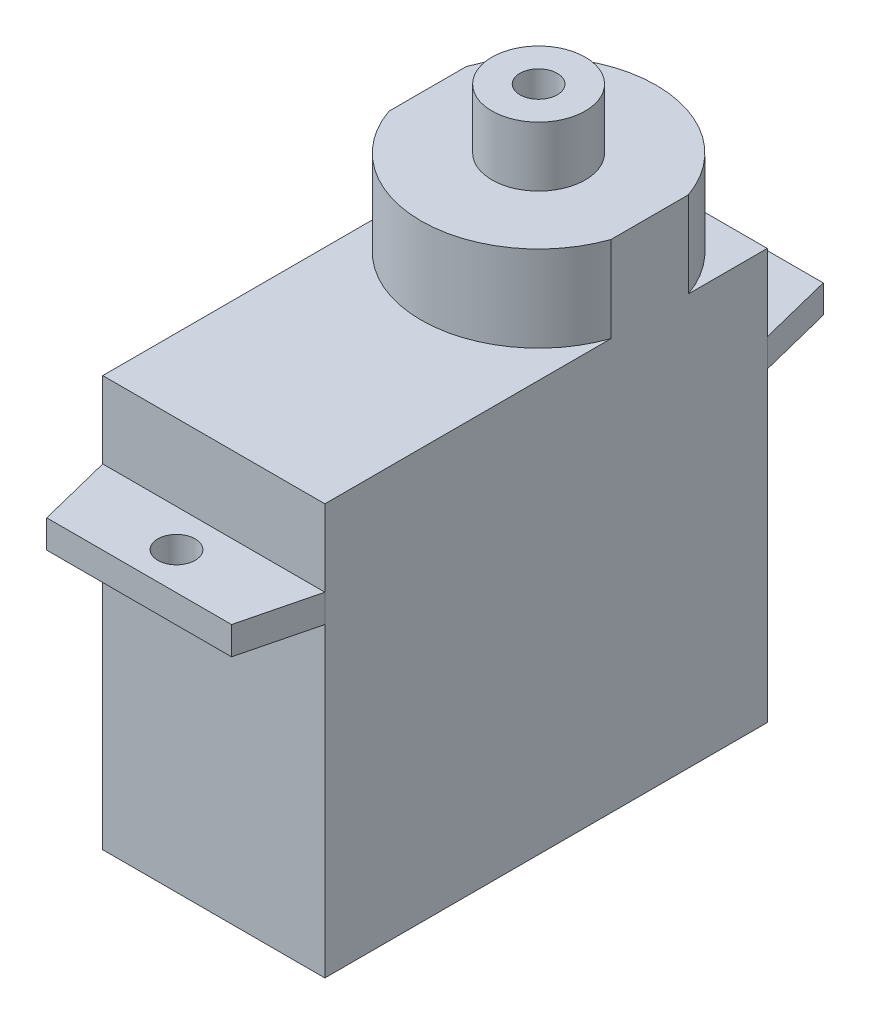
ISO-10303-21;
HEADER;
FILE_DESCRIPTION(('STEP AP214'),'2;1');
FILE_NAME('part.step','',(''),(''),'','','');
FILE_SCHEMA(('AUTOMOTIVE_DESIGN { 1 0 10303 214 1 1 1 1 }'));
ENDSEC;
DATA;
#1=APPLICATION_CONTEXT('core data for automotive mechanical design processes');
#2=APPLICATION_PROTOCOL_DEFINITION('international standard','automotive_design',2000,#1);
#3=PRODUCT_CONTEXT('',#1,'mechanical');
#4=PRODUCT('Part','Part','',(#3));
#5=PRODUCT_RELATED_PRODUCT_CATEGORY('part','',(#4));
#6=PRODUCT_DEFINITION_FORMATION('','',#4);
#7=PRODUCT_DEFINITION_CONTEXT('part definition',#1,'design');
#8=PRODUCT_DEFINITION('design','',#6,#7);
#9=PRODUCT_DEFINITION_SHAPE('','',#8);
#10=(LENGTH_UNIT() NAMED_UNIT(*) SI_UNIT(.MILLI.,.METRE.));
#11=(NAMED_UNIT(*) PLANE_ANGLE_UNIT() SI_UNIT($,.RADIAN.));
#12=(NAMED_UNIT(*) SI_UNIT($,.STERADIAN.) SOLID_ANGLE_UNIT());
#13=UNCERTAINTY_MEASURE_WITH_UNIT(LENGTH_MEASURE(1.E-05),#10,'distance_accuracy_value','');
#14=(GEOMETRIC_REPRESENTATION_CONTEXT(3) GLOBAL_UNCERTAINTY_ASSIGNED_CONTEXT((#13)) GLOBAL_UNIT_ASSIGNED_CONTEXT((#10,
#11,#12)) REPRESENTATION_CONTEXT('',''));
#15=CARTESIAN_POINT('',(0.,0.,0.));
#16=DIRECTION('',(0.,0.,1.));
#17=DIRECTION('',(1.,0.,0.));
#18=AXIS2_PLACEMENT_3D('',#15,#16,#17);
#19=CARTESIAN_POINT('',(0.,22.,0.));
#20=DIRECTION('',(0.,1.,0.));
#21=DIRECTION('',(0.,0.,1.));
#22=AXIS2_PLACEMENT_3D('',#19,#20,#21);
#23=PLANE('',#22);
#24=CARTESIAN_POINT('',(0.,22.,-5.55));
#25=DIRECTION('',(0.,1.,0.));
#26=DIRECTION('',(0.,0.,1.));
#27=AXIS2_PLACEMENT_3D('',#24,#25,#26);
#28=CIRCLE('',#27,6.3);
#29=CARTESIAN_POINT('',(-5.95,22.,-3.47937207591514));
#30=VERTEX_POINT('',#29);
#31=CARTESIAN_POINT('',(5.95,22.,-3.47937207591514));
#32=VERTEX_POINT('',#31);
#33=EDGE_CURVE('E202',#30,#32,#28,.T.);
#34=ORIENTED_EDGE('',*,*,#33,.F.);
#35=DIRECTION('',(0.,0.,1.));
#36=VECTOR('',#35,1.);
#37=CARTESIAN_POINT('',(-5.95,22.,-11.85));
#38=LINE('',#37,#36);
#39=CARTESIAN_POINT('',(-5.95,22.,11.85));
#40=VERTEX_POINT('',#39);
#41=EDGE_CURVE('E221',#30,#40,#38,.T.);
#42=ORIENTED_EDGE('',*,*,#41,.T.);
#43=DIRECTION('',(1.,0.,0.));
#44=VECTOR('',#43,1.);
#45=CARTESIAN_POINT('',(-5.95,22.,11.85));
#46=LINE('',#45,#44);
#47=CARTESIAN_POINT('',(5.95,22.,11.85));
#48=VERTEX_POINT('',#47);
#49=EDGE_CURVE('E220',#40,#48,#46,.T.);
#50=ORIENTED_EDGE('',*,*,#49,.T.);
#51=DIRECTION('',(0.,0.,-1.));
#52=VECTOR('',#51,1.);
#53=CARTESIAN_POINT('',(5.95,22.,-11.85));
#54=LINE('',#53,#52);
#55=EDGE_CURVE('E225',#48,#32,#54,.T.);
#56=ORIENTED_EDGE('',*,*,#55,.T.);
#57=EDGE_LOOP('',(#34,#42,#50,#56));
#58=FACE_BOUND('',#57,.T.);
#59=ADVANCED_FACE('F50',(#58),#23,.T.);
#60=CARTESIAN_POINT('',(0.,22.,-5.55));
#61=DIRECTION('',(0.,1.,0.));
#62=DIRECTION('',(0.,0.,1.));
#63=AXIS2_PLACEMENT_3D('',#60,#61,#62);
#64=CIRCLE('',#63,6.3);
#65=CARTESIAN_POINT('',(5.95,22.,-7.62062792408487));
#66=VERTEX_POINT('',#65);
#67=CARTESIAN_POINT('',(0.,22.,-11.85));
#68=VERTEX_POINT('',#67);
#69=EDGE_CURVE('E73',#66,#68,#64,.T.);
#70=ORIENTED_EDGE('',*,*,#69,.F.);
#71=CARTESIAN_POINT('',(5.95,22.,-11.85));
#72=VERTEX_POINT('',#71);
#73=EDGE_CURVE('E224',#66,#72,#54,.T.);
#74=ORIENTED_EDGE('',*,*,#73,.T.);
#75=DIRECTION('',(-1.,0.,0.));
#76=VECTOR('',#75,1.);
#77=CARTESIAN_POINT('',(-5.95,22.,-11.85));
#78=LINE('',#77,#76);
#79=EDGE_CURVE('E229',#72,#68,#78,.T.);
#80=ORIENTED_EDGE('',*,*,#79,.T.);
#81=EDGE_LOOP('',(#70,#74,#80));
#82=FACE_BOUND('',#81,.T.);
#83=ADVANCED_FACE('F443',(#82),#23,.T.);
#84=CARTESIAN_POINT('',(0.,17.9,0.));
#85=DIRECTION('',(0.,-1.,0.));
#86=DIRECTION('',(0.,0.,-1.));
#87=AXIS2_PLACEMENT_3D('',#84,#85,#86);
#88=PLANE('',#87);
#89=CARTESIAN_POINT('',(0.,17.9,-13.85));
#90=DIRECTION('',(0.,1.,0.));
#91=DIRECTION('',(0.,0.,1.));
#92=AXIS2_PLACEMENT_3D('',#89,#90,#91);
#93=CIRCLE('',#92,1.);
#94=CARTESIAN_POINT('',(0.,17.9,-12.85));
#95=VERTEX_POINT('',#94);
#96=EDGE_CURVE('E260',#95,#95,#93,.T.);
#97=ORIENTED_EDGE('',*,*,#96,.F.);
#98=EDGE_LOOP('',(#97));
#99=FACE_BOUND('',#98,.T.);
#100=DIRECTION('',(-1.,0.,0.));
#101=VECTOR('',#100,1.);
#102=CARTESIAN_POINT('',(-5.95,17.9,-11.85));
#103=LINE('',#102,#101);
#104=CARTESIAN_POINT('',(5.95,17.9,-11.85));
#105=VERTEX_POINT('',#104);
#106=CARTESIAN_POINT('',(-5.95,17.9,-11.85));
#107=VERTEX_POINT('',#106);
#108=EDGE_CURVE('E198',#105,#107,#103,.T.);
#109=ORIENTED_EDGE('',*,*,#108,.F.);
#110=DIRECTION('',(-0.242535625036333,0.,-0.970142500145332));
#111=VECTOR('',#110,1.);
#112=CARTESIAN_POINT('',(4.95,17.9,-15.85));
#113=LINE('',#112,#111);
#114=CARTESIAN_POINT('',(4.95,17.9,-15.85));
#115=VERTEX_POINT('',#114);
#116=EDGE_CURVE('E279',#105,#115,#113,.T.);
#117=ORIENTED_EDGE('',*,*,#116,.T.);
#118=DIRECTION('',(-1.,0.,0.));
#119=VECTOR('',#118,1.);
#120=CARTESIAN_POINT('',(-4.95,17.9,-15.85));
#121=LINE('',#120,#119);
#122=CARTESIAN_POINT('',(-4.95,17.9,-15.85));
#123=VERTEX_POINT('',#122);
#124=EDGE_CURVE('E282',#115,#123,#121,.T.);
#125=ORIENTED_EDGE('',*,*,#124,.T.);
#126=DIRECTION('',(-0.242535625036333,0.,0.970142500145332));
#127=VECTOR('',#126,1.);
#128=CARTESIAN_POINT('',(-5.95,17.9,-11.85));
#129=LINE('',#128,#127);
#130=EDGE_CURVE('E285',#123,#107,#129,.T.);
#131=ORIENTED_EDGE('',*,*,#130,.T.);
#132=EDGE_LOOP('',(#109,#117,#125,#131));
#133=FACE_BOUND('',#132,.T.);
#134=ADVANCED_FACE('F450',(#99,#133),#88,.F.);
#135=CARTESIAN_POINT('',(0.,17.9,13.85));
#136=DIRECTION('',(0.,1.,0.));
#137=DIRECTION('',(0.,0.,1.));
#138=AXIS2_PLACEMENT_3D('',#135,#136,#137);
#139=CIRCLE('',#138,1.);
#140=CARTESIAN_POINT('',(0.,17.9,14.85));
#141=VERTEX_POINT('',#140);
#142=EDGE_CURVE('E252',#141,#141,#139,.T.);
#143=ORIENTED_EDGE('',*,*,#142,.F.);
#144=EDGE_LOOP('',(#143));
#145=FACE_BOUND('',#144,.T.);
#146=DIRECTION('',(1.,0.,0.));
#147=VECTOR('',#146,1.);
#148=CARTESIAN_POINT('',(-5.95,17.9,11.85));
#149=LINE('',#148,#147);
#150=CARTESIAN_POINT('',(-5.95,17.9,11.85));
#151=VERTEX_POINT('',#150);
#152=CARTESIAN_POINT('',(5.95,17.9,11.85));
#153=VERTEX_POINT('',#152);
#154=EDGE_CURVE('E193',#151,#153,#149,.T.);
#155=ORIENTED_EDGE('',*,*,#154,.F.);
#156=DIRECTION('',(0.242535625036333,0.,0.970142500145332));
#157=VECTOR('',#156,1.);
#158=CARTESIAN_POINT('',(-4.95,17.9,15.85));
#159=LINE('',#158,#157);
#160=CARTESIAN_POINT('',(-4.95,17.9,15.85));
#161=VERTEX_POINT('',#160);
#162=EDGE_CURVE('E268',#151,#161,#159,.T.);
#163=ORIENTED_EDGE('',*,*,#162,.T.);
#164=DIRECTION('',(1.,0.,0.));
#165=VECTOR('',#164,1.);
#166=CARTESIAN_POINT('',(4.95,17.9,15.85));
#167=LINE('',#166,#165);
#168=CARTESIAN_POINT('',(4.95,17.9,15.85));
#169=VERTEX_POINT('',#168);
#170=EDGE_CURVE('E271',#161,#169,#167,.T.);
#171=ORIENTED_EDGE('',*,*,#170,.T.);
#172=DIRECTION('',(0.242535625036333,0.,-0.970142500145332));
#173=VECTOR('',#172,1.);
#174=CARTESIAN_POINT('',(5.95,17.9,11.85));
#175=LINE('',#174,#173);
#176=EDGE_CURVE('E275',#169,#153,#175,.T.);
#177=ORIENTED_EDGE('',*,*,#176,.T.);
#178=EDGE_LOOP('',(#155,#163,#171,#177));
#179=FACE_BOUND('',#178,.T.);
#180=ADVANCED_FACE('F402',(#145,#179),#88,.F.);
#181=CARTESIAN_POINT('',(-5.95,16.4,-11.85));
#182=DIRECTION('',(1.,0.,0.));
#183=DIRECTION('',(0.,0.,-1.));
#184=AXIS2_PLACEMENT_3D('',#181,#182,#183);
#185=PLANE('',#184);
#186=DIRECTION('',(0.,0.,1.));
#187=VECTOR('',#186,1.);
#188=CARTESIAN_POINT('',(-5.95,0.,-11.85));
#189=LINE('',#188,#187);
#190=CARTESIAN_POINT('',(-5.95,0.,-11.85));
#191=VERTEX_POINT('',#190);
#192=CARTESIAN_POINT('',(-5.95,0.,11.85));
#193=VERTEX_POINT('',#192);
#194=EDGE_CURVE('E338',#191,#193,#189,.T.);
#195=ORIENTED_EDGE('',*,*,#194,.T.);
#196=DIRECTION('',(0.,-1.,0.));
#197=VECTOR('',#196,1.);
#198=CARTESIAN_POINT('',(-5.95,16.4,11.85));
#199=LINE('',#198,#197);
#200=CARTESIAN_POINT('',(-5.95,16.4,11.85));
#201=VERTEX_POINT('',#200);
#202=EDGE_CURVE('E369',#201,#193,#199,.T.);
#203=ORIENTED_EDGE('',*,*,#202,.F.);
#204=DIRECTION('',(0.,-1.,0.));
#205=VECTOR('',#204,1.);
#206=CARTESIAN_POINT('',(-5.95,17.9,11.85));
#207=LINE('',#206,#205);
#208=EDGE_CURVE('E334',#151,#201,#207,.T.);
#209=ORIENTED_EDGE('',*,*,#208,.F.);
#210=DIRECTION('',(0.,-1.,0.));
#211=VECTOR('',#210,1.);
#212=CARTESIAN_POINT('',(-5.95,22.,11.85));
#213=LINE('',#212,#211);
#214=EDGE_CURVE('E247',#40,#151,#213,.T.);
#215=ORIENTED_EDGE('',*,*,#214,.F.);
#216=ORIENTED_EDGE('',*,*,#41,.F.);
#217=DIRECTION('',(0.,-1.,0.));
#218=VECTOR('',#217,1.);
#219=CARTESIAN_POINT('',(-5.95,70.5311857643959,-3.47937207591514));
#220=LINE('',#219,#218);
#221=CARTESIAN_POINT('',(-5.95,26.6,-3.47937207591514));
#222=VERTEX_POINT('',#221);
#223=EDGE_CURVE('E182',#222,#30,#220,.T.);
#224=ORIENTED_EDGE('',*,*,#223,.F.);
#225=DIRECTION('',(0.,0.,1.));
#226=VECTOR('',#225,1.);
#227=CARTESIAN_POINT('',(-5.95,26.6,-7.62062792408486));
#228=LINE('',#227,#226);
#229=CARTESIAN_POINT('',(-5.95,26.6,-7.62062792408486));
#230=VERTEX_POINT('',#229);
#231=EDGE_CURVE('E176',#230,#222,#228,.T.);
#232=ORIENTED_EDGE('',*,*,#231,.F.);
#233=DIRECTION('',(0.,-1.,0.));
#234=VECTOR('',#233,1.);
#235=CARTESIAN_POINT('',(-5.95,70.5311857643959,-7.62062792408486));
#236=LINE('',#235,#234);
#237=CARTESIAN_POINT('',(-5.95,22.,-7.62062792408486));
#238=VERTEX_POINT('',#237);
#239=EDGE_CURVE('E166',#230,#238,#236,.T.);
#240=ORIENTED_EDGE('',*,*,#239,.T.);
#241=CARTESIAN_POINT('',(-5.95,22.,-11.85));
#242=VERTEX_POINT('',#241);
#243=EDGE_CURVE('E217',#242,#238,#38,.T.);
#244=ORIENTED_EDGE('',*,*,#243,.F.);
#245=DIRECTION('',(0.,-1.,0.));
#246=VECTOR('',#245,1.);
#247=CARTESIAN_POINT('',(-5.95,22.,-11.85));
#248=LINE('',#247,#246);
#249=EDGE_CURVE('E231',#242,#107,#248,.T.);
#250=ORIENTED_EDGE('',*,*,#249,.T.);
#251=DIRECTION('',(0.,-1.,0.));
#252=VECTOR('',#251,1.);
#253=CARTESIAN_POINT('',(-5.95,17.9,-11.85));
#254=LINE('',#253,#252);
#255=CARTESIAN_POINT('',(-5.95,16.4,-11.85));
#256=VERTEX_POINT('',#255);
#257=EDGE_CURVE('E288',#107,#256,#254,.T.);
#258=ORIENTED_EDGE('',*,*,#257,.T.);
#259=DIRECTION('',(0.,-1.,0.));
#260=VECTOR('',#259,1.);
#261=CARTESIAN_POINT('',(-5.95,16.4,-11.85));
#262=LINE('',#261,#260);
#263=EDGE_CURVE('E348',#256,#191,#262,.T.);
#264=ORIENTED_EDGE('',*,*,#263,.T.);
#265=EDGE_LOOP('',(#195,#203,#209,#215,#216,#224,#232,#240,#244,#250,#258,#264));
#266=FACE_BOUND('',#265,.T.);
#267=ADVANCED_FACE('F52',(#266),#185,.F.);
#268=CARTESIAN_POINT('',(-5.95,16.4,11.85));
#269=DIRECTION('',(0.,0.,-1.));
#270=DIRECTION('',(-1.,0.,0.));
#271=AXIS2_PLACEMENT_3D('',#268,#269,#270);
#272=PLANE('',#271);
#273=DIRECTION('',(1.,0.,0.));
#274=VECTOR('',#273,1.);
#275=CARTESIAN_POINT('',(-5.95,0.,11.85));
#276=LINE('',#275,#274);
#277=CARTESIAN_POINT('',(5.95,0.,11.85));
#278=VERTEX_POINT('',#277);
#279=EDGE_CURVE('E351',#193,#278,#276,.T.);
#280=ORIENTED_EDGE('',*,*,#279,.T.);
#281=DIRECTION('',(0.,-1.,0.));
#282=VECTOR('',#281,1.);
#283=CARTESIAN_POINT('',(5.95,16.4,11.85));
#284=LINE('',#283,#282);
#285=CARTESIAN_POINT('',(5.95,16.4,11.85));
#286=VERTEX_POINT('',#285);
#287=EDGE_CURVE('E366',#286,#278,#284,.T.);
#288=ORIENTED_EDGE('',*,*,#287,.F.);
#289=DIRECTION('',(1.,0.,0.));
#290=VECTOR('',#289,1.);
#291=CARTESIAN_POINT('',(-5.95,16.4,11.85));
#292=LINE('',#291,#290);
#293=EDGE_CURVE('E339',#201,#286,#292,.T.);
#294=ORIENTED_EDGE('',*,*,#293,.F.);
#295=ORIENTED_EDGE('',*,*,#202,.T.);
#296=EDGE_LOOP('',(#280,#288,#294,#295));
#297=FACE_BOUND('',#296,.T.);
#298=ADVANCED_FACE('F511',(#297),#272,.F.);
#299=CARTESIAN_POINT('',(5.95,16.4,-11.85));
#300=DIRECTION('',(-1.,0.,0.));
#301=DIRECTION('',(0.,0.,1.));
#302=AXIS2_PLACEMENT_3D('',#299,#300,#301);
#303=PLANE('',#302);
#304=DIRECTION('',(0.,0.,-1.));
#305=VECTOR('',#304,1.);
#306=CARTESIAN_POINT('',(5.95,0.,-11.85));
#307=LINE('',#306,#305);
#308=CARTESIAN_POINT('',(5.95,0.,-11.85));
#309=VERTEX_POINT('',#308);
#310=EDGE_CURVE('E354',#278,#309,#307,.T.);
#311=ORIENTED_EDGE('',*,*,#310,.T.);
#312=DIRECTION('',(0.,-1.,0.));
#313=VECTOR('',#312,1.);
#314=CARTESIAN_POINT('',(5.95,16.4,-11.85));
#315=LINE('',#314,#313);
#316=CARTESIAN_POINT('',(5.95,16.4,-11.85));
#317=VERTEX_POINT('',#316);
#318=EDGE_CURVE('E362',#317,#309,#315,.T.);
#319=ORIENTED_EDGE('',*,*,#318,.F.);
#320=DIRECTION('',(0.,-1.,0.));
#321=VECTOR('',#320,1.);
#322=CARTESIAN_POINT('',(5.95,17.9,-11.85));
#323=LINE('',#322,#321);
#324=EDGE_CURVE('E318',#105,#317,#323,.T.);
#325=ORIENTED_EDGE('',*,*,#324,.F.);
#326=DIRECTION('',(0.,-1.,0.));
#327=VECTOR('',#326,1.);
#328=CARTESIAN_POINT('',(5.95,22.,-11.85));
#329=LINE('',#328,#327);
#330=EDGE_CURVE('E239',#72,#105,#329,.T.);
#331=ORIENTED_EDGE('',*,*,#330,.F.);
#332=ORIENTED_EDGE('',*,*,#73,.F.);
#333=DIRECTION('',(0.,-1.,0.));
#334=VECTOR('',#333,1.);
#335=CARTESIAN_POINT('',(5.95,70.5311857643959,-7.62062792408487));
#336=LINE('',#335,#334);
#337=CARTESIAN_POINT('',(5.95,26.6,-7.62062792408487));
#338=VERTEX_POINT('',#337);
#339=EDGE_CURVE('E211',#338,#66,#336,.T.);
#340=ORIENTED_EDGE('',*,*,#339,.F.);
#341=DIRECTION('',(0.,0.,-1.));
#342=VECTOR('',#341,1.);
#343=CARTESIAN_POINT('',(5.95,26.6,-7.62062792408487));
#344=LINE('',#343,#342);
#345=CARTESIAN_POINT('',(5.95,26.6,-3.47937207591513));
#346=VERTEX_POINT('',#345);
#347=EDGE_CURVE('E191',#346,#338,#344,.T.);
#348=ORIENTED_EDGE('',*,*,#347,.F.);
#349=DIRECTION('',(0.,-1.,0.));
#350=VECTOR('',#349,1.);
#351=CARTESIAN_POINT('',(5.95,70.5311857643959,-3.47937207591513));
#352=LINE('',#351,#350);
#353=EDGE_CURVE('E207',#346,#32,#352,.T.);
#354=ORIENTED_EDGE('',*,*,#353,.T.);
#355=ORIENTED_EDGE('',*,*,#55,.F.);
#356=DIRECTION('',(0.,-1.,0.));
#357=VECTOR('',#356,1.);
#358=CARTESIAN_POINT('',(5.95,22.,11.85));
#359=LINE('',#358,#357);
#360=EDGE_CURVE('E243',#48,#153,#359,.T.);
#361=ORIENTED_EDGE('',*,*,#360,.T.);
#362=DIRECTION('',(0.,-1.,0.));
#363=VECTOR('',#362,1.);
#364=CARTESIAN_POINT('',(5.95,17.9,11.85));
#365=LINE('',#364,#363);
#366=EDGE_CURVE('E322',#153,#286,#365,.T.);
#367=ORIENTED_EDGE('',*,*,#366,.T.);
#368=ORIENTED_EDGE('',*,*,#287,.T.);
#369=EDGE_LOOP('',(#311,#319,#325,#331,#332,#340,#348,#354,#355,#361,#367,#368));
#370=FACE_BOUND('',#369,.T.);
#371=ADVANCED_FACE('F378',(#370),#303,.F.);
#372=CARTESIAN_POINT('',(-5.95,16.4,-11.85));
#373=DIRECTION('',(0.,0.,1.));
#374=DIRECTION('',(1.,0.,0.));
#375=AXIS2_PLACEMENT_3D('',#372,#373,#374);
#376=PLANE('',#375);
#377=DIRECTION('',(-1.,0.,0.));
#378=VECTOR('',#377,1.);
#379=CARTESIAN_POINT('',(-5.95,0.,-11.85));
#380=LINE('',#379,#378);
#381=EDGE_CURVE('E344',#309,#191,#380,.T.);
#382=ORIENTED_EDGE('',*,*,#381,.T.);
#383=ORIENTED_EDGE('',*,*,#263,.F.);
#384=DIRECTION('',(-1.,0.,0.));
#385=VECTOR('',#384,1.);
#386=CARTESIAN_POINT('',(-5.95,16.4,-11.85));
#387=LINE('',#386,#385);
#388=EDGE_CURVE('E343',#317,#256,#387,.T.);
#389=ORIENTED_EDGE('',*,*,#388,.F.);
#390=ORIENTED_EDGE('',*,*,#318,.T.);
#391=EDGE_LOOP('',(#382,#383,#389,#390));
#392=FACE_BOUND('',#391,.T.);
#393=ADVANCED_FACE('F506',(#392),#376,.F.);
#394=CARTESIAN_POINT('',(0.,0.,0.));
#395=DIRECTION('',(0.,1.,0.));
#396=DIRECTION('',(0.,0.,1.));
#397=AXIS2_PLACEMENT_3D('',#394,#395,#396);
#398=PLANE('',#397);
#399=ORIENTED_EDGE('',*,*,#194,.F.);
#400=ORIENTED_EDGE('',*,*,#381,.F.);
#401=ORIENTED_EDGE('',*,*,#310,.F.);
#402=ORIENTED_EDGE('',*,*,#279,.F.);
#403=EDGE_LOOP('',(#399,#400,#401,#402));
#404=FACE_BOUND('',#403,.T.);
#405=ADVANCED_FACE('F503',(#404),#398,.F.);
#406=CARTESIAN_POINT('',(0.,16.4,0.));
#407=DIRECTION('',(0.,-1.,0.));
#408=DIRECTION('',(0.,0.,-1.));
#409=AXIS2_PLACEMENT_3D('',#406,#407,#408);
#410=PLANE('',#409);
#411=CARTESIAN_POINT('',(0.,16.4,13.85));
#412=DIRECTION('',(0.,1.,0.));
#413=DIRECTION('',(0.,0.,1.));
#414=AXIS2_PLACEMENT_3D('',#411,#412,#413);
#415=CIRCLE('',#414,1.);
#416=CARTESIAN_POINT('',(0.,16.4,14.85));
#417=VERTEX_POINT('',#416);
#418=EDGE_CURVE('E251',#417,#417,#415,.T.);
#419=ORIENTED_EDGE('',*,*,#418,.T.);
#420=EDGE_LOOP('',(#419));
#421=FACE_BOUND('',#420,.T.);
#422=DIRECTION('',(0.242535625036333,0.,0.970142500145332));
#423=VECTOR('',#422,1.);
#424=CARTESIAN_POINT('',(-4.95,16.4,15.85));
#425=LINE('',#424,#423);
#426=CARTESIAN_POINT('',(-4.95,16.4,15.85));
#427=VERTEX_POINT('',#426);
#428=EDGE_CURVE('E264',#201,#427,#425,.T.);
#429=ORIENTED_EDGE('',*,*,#428,.F.);
#430=ORIENTED_EDGE('',*,*,#293,.T.);
#431=DIRECTION('',(0.242535625036333,0.,-0.970142500145332));
#432=VECTOR('',#431,1.);
#433=CARTESIAN_POINT('',(5.95,16.4,11.85));
#434=LINE('',#433,#432);
#435=CARTESIAN_POINT('',(4.95,16.4,15.85));
#436=VERTEX_POINT('',#435);
#437=EDGE_CURVE('E294',#436,#286,#434,.T.);
#438=ORIENTED_EDGE('',*,*,#437,.F.);
#439=DIRECTION('',(1.,0.,0.));
#440=VECTOR('',#439,1.);
#441=CARTESIAN_POINT('',(4.95,16.4,15.85));
#442=LINE('',#441,#440);
#443=EDGE_CURVE('E291',#427,#436,#442,.T.);
#444=ORIENTED_EDGE('',*,*,#443,.F.);
#445=EDGE_LOOP('',(#429,#430,#438,#444));
#446=FACE_BOUND('',#445,.T.);
#447=ADVANCED_FACE('F480',(#421,#446),#410,.T.);
#448=CARTESIAN_POINT('',(0.,16.4,-13.85));
#449=DIRECTION('',(0.,1.,0.));
#450=DIRECTION('',(0.,0.,1.));
#451=AXIS2_PLACEMENT_3D('',#448,#449,#450);
#452=CIRCLE('',#451,1.);
#453=CARTESIAN_POINT('',(0.,16.4,-12.85));
#454=VERTEX_POINT('',#453);
#455=EDGE_CURVE('E256',#454,#454,#452,.T.);
#456=ORIENTED_EDGE('',*,*,#455,.T.);
#457=EDGE_LOOP('',(#456));
#458=FACE_BOUND('',#457,.T.);
#459=DIRECTION('',(-0.242535625036333,0.,-0.970142500145332));
#460=VECTOR('',#459,1.);
#461=CARTESIAN_POINT('',(4.95,16.4,-15.85));
#462=LINE('',#461,#460);
#463=CARTESIAN_POINT('',(4.95,16.4,-15.85));
#464=VERTEX_POINT('',#463);
#465=EDGE_CURVE('E298',#317,#464,#462,.T.);
#466=ORIENTED_EDGE('',*,*,#465,.F.);
#467=ORIENTED_EDGE('',*,*,#388,.T.);
#468=DIRECTION('',(-0.242535625036333,0.,0.970142500145332));
#469=VECTOR('',#468,1.);
#470=CARTESIAN_POINT('',(-5.95,16.4,-11.85));
#471=LINE('',#470,#469);
#472=CARTESIAN_POINT('',(-4.95,16.4,-15.85));
#473=VERTEX_POINT('',#472);
#474=EDGE_CURVE('E272',#473,#256,#471,.T.);
#475=ORIENTED_EDGE('',*,*,#474,.F.);
#476=DIRECTION('',(-1.,0.,0.));
#477=VECTOR('',#476,1.);
#478=CARTESIAN_POINT('',(-4.95,16.4,-15.85));
#479=LINE('',#478,#477);
#480=EDGE_CURVE('E301',#464,#473,#479,.T.);
#481=ORIENTED_EDGE('',*,*,#480,.F.);
#482=EDGE_LOOP('',(#466,#467,#475,#481));
#483=FACE_BOUND('',#482,.T.);
#484=ADVANCED_FACE('F477',(#458,#483),#410,.T.);
#485=CARTESIAN_POINT('',(-4.95,17.9,15.85));
#486=DIRECTION('',(0.970142500145332,0.,-0.242535625036333));
#487=DIRECTION('',(-0.242535625036333,0.,-0.970142500145332));
#488=AXIS2_PLACEMENT_3D('',#485,#486,#487);
#489=PLANE('',#488);
#490=ORIENTED_EDGE('',*,*,#428,.T.);
#491=DIRECTION('',(0.,-1.,0.));
#492=VECTOR('',#491,1.);
#493=CARTESIAN_POINT('',(-4.95,17.9,15.85));
#494=LINE('',#493,#492);
#495=EDGE_CURVE('E330',#161,#427,#494,.T.);
#496=ORIENTED_EDGE('',*,*,#495,.F.);
#497=ORIENTED_EDGE('',*,*,#162,.F.);
#498=ORIENTED_EDGE('',*,*,#208,.T.);
#499=EDGE_LOOP('',(#490,#496,#497,#498));
#500=FACE_BOUND('',#499,.T.);
#501=ADVANCED_FACE('F398',(#500),#489,.F.);
#502=CARTESIAN_POINT('',(4.95,17.9,15.85));
#503=DIRECTION('',(0.,0.,-1.));
#504=DIRECTION('',(-1.,0.,0.));
#505=AXIS2_PLACEMENT_3D('',#502,#503,#504);
#506=PLANE('',#505);
#507=ORIENTED_EDGE('',*,*,#443,.T.);
#508=DIRECTION('',(0.,-1.,0.));
#509=VECTOR('',#508,1.);
#510=CARTESIAN_POINT('',(4.95,17.9,15.85));
#511=LINE('',#510,#509);
#512=EDGE_CURVE('E326',#169,#436,#511,.T.);
#513=ORIENTED_EDGE('',*,*,#512,.F.);
#514=ORIENTED_EDGE('',*,*,#170,.F.);
#515=ORIENTED_EDGE('',*,*,#495,.T.);
#516=EDGE_LOOP('',(#507,#513,#514,#515));
#517=FACE_BOUND('',#516,.T.);
#518=ADVANCED_FACE('F496',(#517),#506,.F.);
#519=CARTESIAN_POINT('',(5.95,17.9,11.85));
#520=DIRECTION('',(-0.970142500145332,0.,-0.242535625036333));
#521=DIRECTION('',(-0.242535625036333,0.,0.970142500145332));
#522=AXIS2_PLACEMENT_3D('',#519,#520,#521);
#523=PLANE('',#522);
#524=ORIENTED_EDGE('',*,*,#437,.T.);
#525=ORIENTED_EDGE('',*,*,#366,.F.);
#526=ORIENTED_EDGE('',*,*,#176,.F.);
#527=ORIENTED_EDGE('',*,*,#512,.T.);
#528=EDGE_LOOP('',(#524,#525,#526,#527));
#529=FACE_BOUND('',#528,.T.);
#530=ADVANCED_FACE('F492',(#529),#523,.F.);
#531=CARTESIAN_POINT('',(4.95,17.9,-15.85));
#532=DIRECTION('',(-0.970142500145332,0.,0.242535625036333));
#533=DIRECTION('',(0.242535625036333,0.,0.970142500145332));
#534=AXIS2_PLACEMENT_3D('',#531,#532,#533);
#535=PLANE('',#534);
#536=ORIENTED_EDGE('',*,*,#465,.T.);
#537=DIRECTION('',(0.,-1.,0.));
#538=VECTOR('',#537,1.);
#539=CARTESIAN_POINT('',(4.95,17.9,-15.85));
#540=LINE('',#539,#538);
#541=EDGE_CURVE('E314',#115,#464,#540,.T.);
#542=ORIENTED_EDGE('',*,*,#541,.F.);
#543=ORIENTED_EDGE('',*,*,#116,.F.);
#544=ORIENTED_EDGE('',*,*,#324,.T.);
#545=EDGE_LOOP('',(#536,#542,#543,#544));
#546=FACE_BOUND('',#545,.T.);
#547=ADVANCED_FACE('F488',(#546),#535,.F.);
#548=CARTESIAN_POINT('',(-4.95,17.9,-15.85));
#549=DIRECTION('',(0.,0.,1.));
#550=DIRECTION('',(1.,0.,0.));
#551=AXIS2_PLACEMENT_3D('',#548,#549,#550);
#552=PLANE('',#551);
#553=ORIENTED_EDGE('',*,*,#480,.T.);
#554=DIRECTION('',(0.,-1.,0.));
#555=VECTOR('',#554,1.);
#556=CARTESIAN_POINT('',(-4.95,17.9,-15.85));
#557=LINE('',#556,#555);
#558=EDGE_CURVE('E310',#123,#473,#557,.T.);
#559=ORIENTED_EDGE('',*,*,#558,.F.);
#560=ORIENTED_EDGE('',*,*,#124,.F.);
#561=ORIENTED_EDGE('',*,*,#541,.T.);
#562=EDGE_LOOP('',(#553,#559,#560,#561));
#563=FACE_BOUND('',#562,.T.);
#564=ADVANCED_FACE('F484',(#563),#552,.F.);
#565=CARTESIAN_POINT('',(-5.95,17.9,-11.85));
#566=DIRECTION('',(0.970142500145332,0.,0.242535625036333));
#567=DIRECTION('',(0.242535625036333,0.,-0.970142500145332));
#568=AXIS2_PLACEMENT_3D('',#565,#566,#567);
#569=PLANE('',#568);
#570=ORIENTED_EDGE('',*,*,#474,.T.);
#571=ORIENTED_EDGE('',*,*,#257,.F.);
#572=ORIENTED_EDGE('',*,*,#130,.F.);
#573=ORIENTED_EDGE('',*,*,#558,.T.);
#574=EDGE_LOOP('',(#570,#571,#572,#573));
#575=FACE_BOUND('',#574,.T.);
#576=ADVANCED_FACE('F472',(#575),#569,.F.);
#577=CARTESIAN_POINT('',(0.,17.9,-13.85));
#578=DIRECTION('',(0.,-1.,0.));
#579=DIRECTION('',(0.,0.,-1.));
#580=AXIS2_PLACEMENT_3D('',#577,#578,#579);
#581=CYLINDRICAL_SURFACE('',#580,1.);
#582=ORIENTED_EDGE('',*,*,#96,.T.);
#583=EDGE_LOOP('',(#582));
#584=FACE_BOUND('',#583,.T.);
#585=ORIENTED_EDGE('',*,*,#455,.F.);
#586=EDGE_LOOP('',(#585));
#587=FACE_BOUND('',#586,.T.);
#588=ADVANCED_FACE('F468',(#584,#587),#581,.F.);
#589=CARTESIAN_POINT('',(0.,17.9,13.85));
#590=DIRECTION('',(0.,-1.,0.));
#591=DIRECTION('',(0.,0.,-1.));
#592=AXIS2_PLACEMENT_3D('',#589,#590,#591);
#593=CYLINDRICAL_SURFACE('',#592,1.);
#594=ORIENTED_EDGE('',*,*,#142,.T.);
#595=EDGE_LOOP('',(#594));
#596=FACE_BOUND('',#595,.T.);
#597=ORIENTED_EDGE('',*,*,#418,.F.);
#598=EDGE_LOOP('',(#597));
#599=FACE_BOUND('',#598,.T.);
#600=ADVANCED_FACE('F463',(#596,#599),#593,.F.);
#601=CARTESIAN_POINT('',(-5.95,22.,11.85));
#602=DIRECTION('',(0.,0.,-1.));
#603=DIRECTION('',(-1.,0.,0.));
#604=AXIS2_PLACEMENT_3D('',#601,#602,#603);
#605=PLANE('',#604);
#606=ORIENTED_EDGE('',*,*,#154,.T.);
#607=ORIENTED_EDGE('',*,*,#360,.F.);
#608=ORIENTED_EDGE('',*,*,#49,.F.);
#609=ORIENTED_EDGE('',*,*,#214,.T.);
#610=EDGE_LOOP('',(#606,#607,#608,#609));
#611=FACE_BOUND('',#610,.T.);
#612=ADVANCED_FACE('F392',(#611),#605,.F.);
#613=CARTESIAN_POINT('',(-5.95,22.,-11.85));
#614=DIRECTION('',(0.,0.,1.));
#615=DIRECTION('',(1.,0.,0.));
#616=AXIS2_PLACEMENT_3D('',#613,#614,#615);
#617=PLANE('',#616);
#618=ORIENTED_EDGE('',*,*,#108,.T.);
#619=ORIENTED_EDGE('',*,*,#249,.F.);
#620=EDGE_CURVE('E228',#68,#242,#78,.T.);
#621=ORIENTED_EDGE('',*,*,#620,.F.);
#622=ORIENTED_EDGE('',*,*,#79,.F.);
#623=ORIENTED_EDGE('',*,*,#330,.T.);
#624=EDGE_LOOP('',(#618,#619,#621,#622,#623));
#625=FACE_BOUND('',#624,.T.);
#626=ADVANCED_FACE('F453',(#625),#617,.F.);
#627=EDGE_CURVE('E59',#68,#238,#64,.T.);
#628=ORIENTED_EDGE('',*,*,#627,.F.);
#629=ORIENTED_EDGE('',*,*,#620,.T.);
#630=ORIENTED_EDGE('',*,*,#243,.T.);
#631=EDGE_LOOP('',(#628,#629,#630));
#632=FACE_BOUND('',#631,.T.);
#633=ADVANCED_FACE('F445',(#632),#23,.T.);
#634=CARTESIAN_POINT('',(0.,70.5311857643959,-5.55));
#635=DIRECTION('',(0.,-1.,0.));
#636=DIRECTION('',(0.,0.,-1.));
#637=AXIS2_PLACEMENT_3D('',#634,#635,#636);
#638=CYLINDRICAL_SURFACE('',#637,6.3);
#639=CARTESIAN_POINT('',(0.,26.6,-5.55));
#640=DIRECTION('',(0.,1.,0.));
#641=DIRECTION('',(0.,0.,1.));
#642=AXIS2_PLACEMENT_3D('',#639,#640,#641);
#643=CIRCLE('',#642,6.3);
#644=EDGE_CURVE('E187',#222,#346,#643,.T.);
#645=ORIENTED_EDGE('',*,*,#644,.F.);
#646=ORIENTED_EDGE('',*,*,#223,.T.);
#647=ORIENTED_EDGE('',*,*,#33,.T.);
#648=ORIENTED_EDGE('',*,*,#353,.F.);
#649=EDGE_LOOP('',(#645,#646,#647,#648));
#650=FACE_BOUND('',#649,.T.);
#651=ADVANCED_FACE('F406',(#650),#638,.T.);
#652=CARTESIAN_POINT('',(0.,70.5311857643959,-5.55));
#653=DIRECTION('',(0.,-1.,0.));
#654=DIRECTION('',(0.,0.,-1.));
#655=AXIS2_PLACEMENT_3D('',#652,#653,#654);
#656=CYLINDRICAL_SURFACE('',#655,6.3);
#657=CARTESIAN_POINT('',(0.,26.6,-5.55));
#658=DIRECTION('',(0.,1.,0.));
#659=DIRECTION('',(0.,0.,1.));
#660=AXIS2_PLACEMENT_3D('',#657,#658,#659);
#661=CIRCLE('',#660,6.3);
#662=EDGE_CURVE('E171',#338,#230,#661,.T.);
#663=ORIENTED_EDGE('',*,*,#662,.F.);
#664=ORIENTED_EDGE('',*,*,#339,.T.);
#665=ORIENTED_EDGE('',*,*,#69,.T.);
#666=ORIENTED_EDGE('',*,*,#627,.T.);
#667=ORIENTED_EDGE('',*,*,#239,.F.);
#668=EDGE_LOOP('',(#663,#664,#665,#666,#667));
#669=FACE_BOUND('',#668,.T.);
#670=ADVANCED_FACE('F168',(#669),#656,.T.);
#671=CARTESIAN_POINT('',(0.,26.6,0.));
#672=DIRECTION('',(0.,1.,0.));
#673=DIRECTION('',(0.,0.,1.));
#674=AXIS2_PLACEMENT_3D('',#671,#672,#673);
#675=PLANE('',#674);
#676=CARTESIAN_POINT('',(0.,26.6,-5.55));
#677=DIRECTION('',(0.,1.,0.));
#678=DIRECTION('',(0.,0.,1.));
#679=AXIS2_PLACEMENT_3D('',#676,#677,#678);
#680=CIRCLE('',#679,2.5);
#681=CARTESIAN_POINT('',(0.,26.6,-8.05));
#682=VERTEX_POINT('',#681);
#683=EDGE_CURVE('E411',#682,#682,#680,.T.);
#684=ORIENTED_EDGE('',*,*,#683,.F.);
#685=EDGE_LOOP('',(#684));
#686=FACE_BOUND('',#685,.T.);
#687=ORIENTED_EDGE('',*,*,#231,.T.);
#688=ORIENTED_EDGE('',*,*,#644,.T.);
#689=ORIENTED_EDGE('',*,*,#347,.T.);
#690=ORIENTED_EDGE('',*,*,#662,.T.);
#691=EDGE_LOOP('',(#687,#688,#689,#690));
#692=FACE_BOUND('',#691,.T.);
#693=ADVANCED_FACE('F190',(#686,#692),#675,.T.);
#694=CARTESIAN_POINT('',(0.,66.6710678118655,-5.55));
#695=DIRECTION('',(0.,-1.,0.));
#696=DIRECTION('',(0.,0.,-1.));
#697=AXIS2_PLACEMENT_3D('',#694,#695,#696);
#698=CYLINDRICAL_SURFACE('',#697,2.5);
#699=CARTESIAN_POINT('',(0.,29.8,-5.55));
#700=DIRECTION('',(0.,1.,0.));
#701=DIRECTION('',(0.,0.,1.));
#702=AXIS2_PLACEMENT_3D('',#699,#700,#701);
#703=CIRCLE('',#702,2.5);
#704=CARTESIAN_POINT('',(0.,29.8,-8.05));
#705=VERTEX_POINT('',#704);
#706=EDGE_CURVE('E216',#705,#705,#703,.T.);
#707=CARTESIAN_POINT('',(0.,26.6,-8.05));
#708=CARTESIAN_POINT('',(0.,26.6333333333333,-8.05));
#709=CARTESIAN_POINT('',(0.,26.6666666666667,-8.05));
#710=CARTESIAN_POINT('',(0.,26.7333333333333,-8.05));
#711=CARTESIAN_POINT('',(0.,26.7666666666667,-8.05));
#712=CARTESIAN_POINT('',(0.,26.8333333333333,-8.05));
#713=CARTESIAN_POINT('',(0.,26.8666666666667,-8.05));
#714=CARTESIAN_POINT('',(0.,26.9333333333333,-8.05));
#715=CARTESIAN_POINT('',(0.,26.9666666666667,-8.05));
#716=CARTESIAN_POINT('',(0.,27.0333333333333,-8.05));
#717=CARTESIAN_POINT('',(0.,27.0666666666667,-8.05));
#718=CARTESIAN_POINT('',(0.,27.1333333333333,-8.05));
#719=CARTESIAN_POINT('',(0.,27.1666666666667,-8.05));
#720=CARTESIAN_POINT('',(0.,27.2333333333333,-8.05));
#721=CARTESIAN_POINT('',(0.,27.2666666666667,-8.05));
#722=CARTESIAN_POINT('',(0.,27.3333333333333,-8.05));
#723=CARTESIAN_POINT('',(0.,27.3666666666667,-8.05));
#724=CARTESIAN_POINT('',(0.,27.4333333333333,-8.05));
#725=CARTESIAN_POINT('',(0.,27.4666666666667,-8.05));
#726=CARTESIAN_POINT('',(0.,27.5333333333333,-8.05));
#727=CARTESIAN_POINT('',(0.,27.5666666666667,-8.05));
#728=CARTESIAN_POINT('',(0.,27.6333333333333,-8.05));
#729=CARTESIAN_POINT('',(0.,27.6666666666667,-8.05));
#730=CARTESIAN_POINT('',(0.,27.7333333333333,-8.05));
#731=CARTESIAN_POINT('',(0.,27.7666666666667,-8.05));
#732=CARTESIAN_POINT('',(0.,27.8333333333333,-8.05));
#733=CARTESIAN_POINT('',(0.,27.8666666666667,-8.05));
#734=CARTESIAN_POINT('',(0.,27.9333333333333,-8.05));
#735=CARTESIAN_POINT('',(0.,27.9666666666667,-8.05));
#736=CARTESIAN_POINT('',(0.,28.0333333333333,-8.05));
#737=CARTESIAN_POINT('',(0.,28.0666666666667,-8.05));
#738=CARTESIAN_POINT('',(0.,28.1333333333333,-8.05));
#739=CARTESIAN_POINT('',(0.,28.1666666666667,-8.05));
#740=CARTESIAN_POINT('',(0.,28.2333333333333,-8.05));
#741=CARTESIAN_POINT('',(0.,28.2666666666667,-8.05));
#742=CARTESIAN_POINT('',(0.,28.3333333333333,-8.05));
#743=CARTESIAN_POINT('',(0.,28.3666666666667,-8.05));
#744=CARTESIAN_POINT('',(0.,28.4333333333333,-8.05));
#745=CARTESIAN_POINT('',(0.,28.4666666666667,-8.05));
#746=CARTESIAN_POINT('',(0.,28.5333333333333,-8.05));
#747=CARTESIAN_POINT('',(0.,28.5666666666667,-8.05));
#748=CARTESIAN_POINT('',(0.,28.6333333333333,-8.05));
#749=CARTESIAN_POINT('',(0.,28.6666666666667,-8.05));
#750=CARTESIAN_POINT('',(0.,28.7333333333333,-8.05));
#751=CARTESIAN_POINT('',(0.,28.7666666666667,-8.05));
#752=CARTESIAN_POINT('',(0.,28.8333333333333,-8.05));
#753=CARTESIAN_POINT('',(0.,28.8666666666667,-8.05));
#754=CARTESIAN_POINT('',(0.,28.9333333333333,-8.05));
#755=CARTESIAN_POINT('',(0.,28.9666666666667,-8.05));
#756=CARTESIAN_POINT('',(0.,29.0333333333333,-8.05));
#757=CARTESIAN_POINT('',(0.,29.0666666666667,-8.05));
#758=CARTESIAN_POINT('',(0.,29.1333333333333,-8.05));
#759=CARTESIAN_POINT('',(0.,29.1666666666667,-8.05));
#760=CARTESIAN_POINT('',(0.,29.2333333333333,-8.05));
#761=CARTESIAN_POINT('',(0.,29.2666666666667,-8.05));
#762=CARTESIAN_POINT('',(0.,29.3333333333333,-8.05));
#763=CARTESIAN_POINT('',(0.,29.3666666666667,-8.05));
#764=CARTESIAN_POINT('',(0.,29.4333333333333,-8.05));
#765=CARTESIAN_POINT('',(0.,29.4666666666667,-8.05));
#766=CARTESIAN_POINT('',(0.,29.5333333333333,-8.05));
#767=CARTESIAN_POINT('',(0.,29.5666666666667,-8.05));
#768=CARTESIAN_POINT('',(0.,29.6333333333333,-8.05));
#769=CARTESIAN_POINT('',(0.,29.6666666666667,-8.05));
#770=CARTESIAN_POINT('',(0.,29.7333333333333,-8.05));
#771=CARTESIAN_POINT('',(0.,29.7666666666667,-8.05));
#772=CARTESIAN_POINT('',(0.,29.8,-8.05));
#773=B_SPLINE_CURVE_WITH_KNOTS('',3,(#707,#708,#709,#710,#711,#712,#713,#714,#715,#716,#717,
#718,#719,#720,#721,#722,#723,#724,#725,#726,#727,#728,#729,#730,#731,#732,#733,#734,#735,#736,
#737,#738,#739,#740,#741,#742,#743,#744,#745,#746,#747,#748,#749,#750,#751,#752,#753,#754,#755,
#756,#757,#758,#759,#760,#761,#762,#763,#764,#765,#766,#767,#768,#769,#770,#771,#772),
.UNSPECIFIED.,.F.,.F.,(4,2,2,2,2,2,2,2,2,2,2,2,2,2,2,2,2,2,2,2,2,2,2,2,2,2,2,2,2,2,2,2,4),(0.,
0.100000000000003,0.199999999999999,0.300000000000002,0.399999999999998,0.5,0.599999999999996,
0.699999999999999,0.799999999999995,0.899999999999998,1.,1.1,1.2,1.3,1.4,1.49999999999999,1.6,
1.7,1.8,1.9,1.99999999999999,2.1,2.19999999999999,2.3,2.4,2.5,2.6,2.69999999999999,2.8,
2.89999999999999,3.,3.09999999999999,3.19999999999999),.UNSPECIFIED.);
#774=EDGE_CURVE('BSEAM429',#682,#705,#773,.T.);
#775=ORIENTED_EDGE('',*,*,#683,.T.);
#776=ORIENTED_EDGE('',*,*,#706,.F.);
#777=ORIENTED_EDGE('',*,*,#774,.T.);
#778=ORIENTED_EDGE('',*,*,#774,.F.);
#779=EDGE_LOOP('',(#775,#777,#776,#778));
#780=FACE_BOUND('',#779,.T.);
#781=ADVANCED_FACE('F429',(#780),#698,.T.);
#782=CARTESIAN_POINT('',(0.,66.6710678118655,-5.55));
#783=DIRECTION('',(0.,-1.,0.));
#784=DIRECTION('',(0.,0.,-1.));
#785=AXIS2_PLACEMENT_3D('',#782,#783,#784);
#786=CYLINDRICAL_SURFACE('',#785,1.);
#787=CARTESIAN_POINT('',(0.,26.6,-5.55));
#788=DIRECTION('',(0.,1.,0.));
#789=DIRECTION('',(0.,0.,1.));
#790=AXIS2_PLACEMENT_3D('',#787,#788,#789);
#791=CIRCLE('',#790,1.);
#792=CARTESIAN_POINT('',(0.,26.6,-6.55));
#793=VERTEX_POINT('',#792);
#794=EDGE_CURVE('E12',#793,#793,#791,.F.);
#795=CARTESIAN_POINT('',(0.,29.8,-5.55));
#796=DIRECTION('',(0.,1.,0.));
#797=DIRECTION('',(0.,0.,1.));
#798=AXIS2_PLACEMENT_3D('',#795,#796,#797);
#799=CIRCLE('',#798,1.);
#800=CARTESIAN_POINT('',(0.,29.8,-6.55));
#801=VERTEX_POINT('',#800);
#802=EDGE_CURVE('E415',#801,#801,#799,.T.);
#803=CARTESIAN_POINT('',(0.,26.6,-6.55));
#804=CARTESIAN_POINT('',(0.,26.6333333333333,-6.55));
#805=CARTESIAN_POINT('',(0.,26.6666666666667,-6.55));
#806=CARTESIAN_POINT('',(0.,26.7333333333333,-6.55));
#807=CARTESIAN_POINT('',(0.,26.7666666666667,-6.55));
#808=CARTESIAN_POINT('',(0.,26.8333333333333,-6.55));
#809=CARTESIAN_POINT('',(0.,26.8666666666667,-6.55));
#810=CARTESIAN_POINT('',(0.,26.9333333333333,-6.55));
#811=CARTESIAN_POINT('',(0.,26.9666666666667,-6.55));
#812=CARTESIAN_POINT('',(0.,27.0333333333333,-6.55));
#813=CARTESIAN_POINT('',(0.,27.0666666666667,-6.55));
#814=CARTESIAN_POINT('',(0.,27.1333333333333,-6.55));
#815=CARTESIAN_POINT('',(0.,27.1666666666667,-6.55));
#816=CARTESIAN_POINT('',(0.,27.2333333333333,-6.55));
#817=CARTESIAN_POINT('',(0.,27.2666666666667,-6.55));
#818=CARTESIAN_POINT('',(0.,27.3333333333333,-6.55));
#819=CARTESIAN_POINT('',(0.,27.3666666666667,-6.55));
#820=CARTESIAN_POINT('',(0.,27.4333333333333,-6.55));
#821=CARTESIAN_POINT('',(0.,27.4666666666667,-6.55));
#822=CARTESIAN_POINT('',(0.,27.5333333333333,-6.55));
#823=CARTESIAN_POINT('',(0.,27.5666666666667,-6.55));
#824=CARTESIAN_POINT('',(0.,27.6333333333333,-6.55));
#825=CARTESIAN_POINT('',(0.,27.6666666666667,-6.55));
#826=CARTESIAN_POINT('',(0.,27.7333333333333,-6.55));
#827=CARTESIAN_POINT('',(0.,27.7666666666667,-6.55));
#828=CARTESIAN_POINT('',(0.,27.8333333333333,-6.55));
#829=CARTESIAN_POINT('',(0.,27.8666666666667,-6.55));
#830=CARTESIAN_POINT('',(0.,27.9333333333333,-6.55));
#831=CARTESIAN_POINT('',(0.,27.9666666666667,-6.55));
#832=CARTESIAN_POINT('',(0.,28.0333333333333,-6.55));
#833=CARTESIAN_POINT('',(0.,28.0666666666667,-6.55));
#834=CARTESIAN_POINT('',(0.,28.1333333333333,-6.55));
#835=CARTESIAN_POINT('',(0.,28.1666666666667,-6.55));
#836=CARTESIAN_POINT('',(0.,28.2333333333333,-6.55));
#837=CARTESIAN_POINT('',(0.,28.2666666666667,-6.55));
#838=CARTESIAN_POINT('',(0.,28.3333333333333,-6.55));
#839=CARTESIAN_POINT('',(0.,28.3666666666667,-6.55));
#840=CARTESIAN_POINT('',(0.,28.4333333333333,-6.55));
#841=CARTESIAN_POINT('',(0.,28.4666666666667,-6.55));
#842=CARTESIAN_POINT('',(0.,28.5333333333333,-6.55));
#843=CARTESIAN_POINT('',(0.,28.5666666666667,-6.55));
#844=CARTESIAN_POINT('',(0.,28.6333333333333,-6.55));
#845=CARTESIAN_POINT('',(0.,28.6666666666667,-6.55));
#846=CARTESIAN_POINT('',(0.,28.7333333333333,-6.55));
#847=CARTESIAN_POINT('',(0.,28.7666666666667,-6.55));
#848=CARTESIAN_POINT('',(0.,28.8333333333333,-6.55));
#849=CARTESIAN_POINT('',(0.,28.8666666666667,-6.55));
#850=CARTESIAN_POINT('',(0.,28.9333333333333,-6.55));
#851=CARTESIAN_POINT('',(0.,28.9666666666667,-6.55));
#852=CARTESIAN_POINT('',(0.,29.0333333333333,-6.55));
#853=CARTESIAN_POINT('',(0.,29.0666666666667,-6.55));
#854=CARTESIAN_POINT('',(0.,29.1333333333333,-6.55));
#855=CARTESIAN_POINT('',(0.,29.1666666666667,-6.55));
#856=CARTESIAN_POINT('',(0.,29.2333333333333,-6.55));
#857=CARTESIAN_POINT('',(0.,29.2666666666667,-6.55));
#858=CARTESIAN_POINT('',(0.,29.3333333333333,-6.55));
#859=CARTESIAN_POINT('',(0.,29.3666666666667,-6.55));
#860=CARTESIAN_POINT('',(0.,29.4333333333333,-6.55));
#861=CARTESIAN_POINT('',(0.,29.4666666666667,-6.55));
#862=CARTESIAN_POINT('',(0.,29.5333333333333,-6.55));
#863=CARTESIAN_POINT('',(0.,29.5666666666667,-6.55));
#864=CARTESIAN_POINT('',(0.,29.6333333333333,-6.55));
#865=CARTESIAN_POINT('',(0.,29.6666666666667,-6.55));
#866=CARTESIAN_POINT('',(0.,29.7333333333333,-6.55));
#867=CARTESIAN_POINT('',(0.,29.7666666666667,-6.55));
#868=CARTESIAN_POINT('',(0.,29.8,-6.55));
#869=B_SPLINE_CURVE_WITH_KNOTS('',3,(#803,#804,#805,#806,#807,#808,#809,#810,#811,#812,#813,
#814,#815,#816,#817,#818,#819,#820,#821,#822,#823,#824,#825,#826,#827,#828,#829,#830,#831,#832,
#833,#834,#835,#836,#837,#838,#839,#840,#841,#842,#843,#844,#845,#846,#847,#848,#849,#850,#851,
#852,#853,#854,#855,#856,#857,#858,#859,#860,#861,#862,#863,#864,#865,#866,#867,#868),
.UNSPECIFIED.,.F.,.F.,(4,2,2,2,2,2,2,2,2,2,2,2,2,2,2,2,2,2,2,2,2,2,2,2,2,2,2,2,2,2,2,2,4),(0.,
0.100000000000003,0.199999999999999,0.300000000000002,0.399999999999998,0.5,0.600000000000003,
0.699999999999999,0.800000000000002,0.900000000000005,1.,1.1,1.20000000000001,1.3,
1.40000000000001,1.5,1.6,1.70000000000001,1.8,1.90000000000001,2.,2.1,2.20000000000001,2.3,
2.40000000000001,2.50000000000001,2.6,2.70000000000001,2.80000000000001,2.90000000000001,
3.00000000000001,3.10000000000001,3.20000000000001),.UNSPECIFIED.);
#870=EDGE_CURVE('BSEAM420',#793,#801,#869,.T.);
#871=ORIENTED_EDGE('',*,*,#794,.T.);
#872=ORIENTED_EDGE('',*,*,#802,.T.);
#873=ORIENTED_EDGE('',*,*,#870,.T.);
#874=ORIENTED_EDGE('',*,*,#870,.F.);
#875=EDGE_LOOP('',(#871,#873,#872,#874));
#876=FACE_BOUND('',#875,.T.);
#877=ADVANCED_FACE('F420',(#876),#786,.F.);
#878=CARTESIAN_POINT('',(0.,29.8,0.));
#879=DIRECTION('',(0.,1.,0.));
#880=DIRECTION('',(0.,0.,1.));
#881=AXIS2_PLACEMENT_3D('',#878,#879,#880);
#882=PLANE('',#881);
#883=ORIENTED_EDGE('',*,*,#802,.F.);
#884=EDGE_LOOP('',(#883));
#885=FACE_BOUND('',#884,.T.);
#886=ORIENTED_EDGE('',*,*,#706,.T.);
#887=EDGE_LOOP('',(#886));
#888=FACE_BOUND('',#887,.T.);
#889=ADVANCED_FACE('F422',(#885,#888),#882,.T.);
#890=ORIENTED_EDGE('',*,*,#794,.F.);
#891=EDGE_LOOP('',(#890));
#892=FACE_BOUND('',#891,.T.);
#893=ADVANCED_FACE('F425',(#892),#675,.T.);
#894=CLOSED_SHELL('',(#59,#83,#134,#180,#267,#298,#371,#393,#405,#447,#484,#501,#518,#530,#547,
#564,#576,#588,#600,#612,#626,#633,#651,#670,#693,#781,#877,#889,#893));
#895=MANIFOLD_SOLID_BREP('B2',#894);
#896=ADVANCED_BREP_SHAPE_REPRESENTATION('',(#18,#895),#14);
#897=SHAPE_DEFINITION_REPRESENTATION(#9,#896);
ENDSEC;
END-ISO-10303-21;
